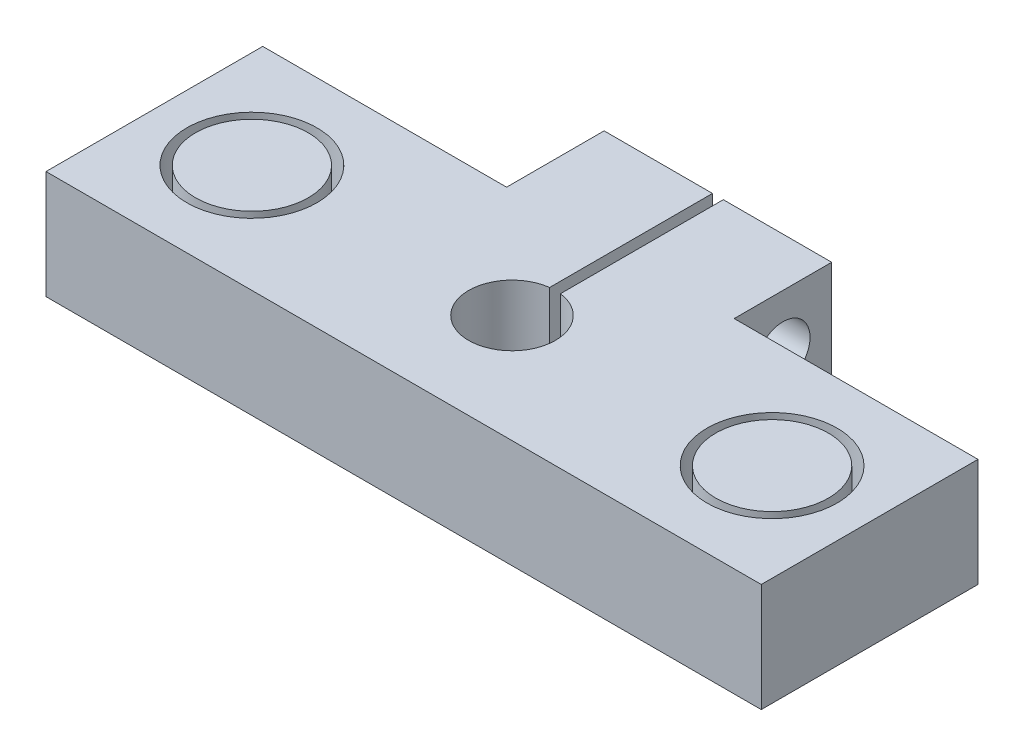
ISO-10303-21;
HEADER;
FILE_DESCRIPTION(('STEP AP214'),'2;1');
FILE_NAME('part.step','',(''),(''),'','','');
FILE_SCHEMA(('AUTOMOTIVE_DESIGN { 1 0 10303 214 1 1 1 1 }'));
ENDSEC;
DATA;
#1=APPLICATION_CONTEXT('core data for automotive mechanical design processes');
#2=APPLICATION_PROTOCOL_DEFINITION('international standard','automotive_design',2000,#1);
#3=PRODUCT_CONTEXT('',#1,'mechanical');
#4=PRODUCT('Part','Part','',(#3));
#5=PRODUCT_RELATED_PRODUCT_CATEGORY('part','',(#4));
#6=PRODUCT_DEFINITION_FORMATION('','',#4);
#7=PRODUCT_DEFINITION_CONTEXT('part definition',#1,'design');
#8=PRODUCT_DEFINITION('design','',#6,#7);
#9=PRODUCT_DEFINITION_SHAPE('','',#8);
#10=(LENGTH_UNIT() NAMED_UNIT(*) SI_UNIT(.MILLI.,.METRE.));
#11=(NAMED_UNIT(*) PLANE_ANGLE_UNIT() SI_UNIT($,.RADIAN.));
#12=(NAMED_UNIT(*) SI_UNIT($,.STERADIAN.) SOLID_ANGLE_UNIT());
#13=UNCERTAINTY_MEASURE_WITH_UNIT(LENGTH_MEASURE(1.E-05),#10,'distance_accuracy_value','');
#14=(GEOMETRIC_REPRESENTATION_CONTEXT(3) GLOBAL_UNCERTAINTY_ASSIGNED_CONTEXT((#13)) GLOBAL_UNIT_ASSIGNED_CONTEXT((#10,
#11,#12)) REPRESENTATION_CONTEXT('',''));
#15=CARTESIAN_POINT('',(0.,0.,0.));
#16=DIRECTION('',(0.,0.,1.));
#17=DIRECTION('',(1.,0.,0.));
#18=AXIS2_PLACEMENT_3D('',#15,#16,#17);
#19=CARTESIAN_POINT('',(0.,10.,0.));
#20=DIRECTION('',(0.,-1.,0.));
#21=DIRECTION('',(0.,0.,-1.));
#22=AXIS2_PLACEMENT_3D('',#19,#20,#21);
#23=CYLINDRICAL_SURFACE('',#22,4.);
#24=CARTESIAN_POINT('',(0.,0.,0.));
#25=DIRECTION('',(0.,1.,0.));
#26=DIRECTION('',(0.,0.,1.));
#27=AXIS2_PLACEMENT_3D('',#24,#25,#26);
#28=CIRCLE('',#27,4.);
#29=CARTESIAN_POINT('',(-0.5,0.,-3.96862696659689));
#30=VERTEX_POINT('',#29);
#31=CARTESIAN_POINT('',(0.5,0.,-3.96862696659689));
#32=VERTEX_POINT('',#31);
#33=EDGE_CURVE('E158',#30,#32,#28,.T.);
#34=ORIENTED_EDGE('',*,*,#33,.F.);
#35=DIRECTION('',(0.,-1.,0.));
#36=VECTOR('',#35,1.);
#37=CARTESIAN_POINT('',(-0.5,10.,-3.96862696659689));
#38=LINE('',#37,#36);
#39=CARTESIAN_POINT('',(-0.5,10.,-3.96862696659689));
#40=VERTEX_POINT('',#39);
#41=EDGE_CURVE('E11',#40,#30,#38,.T.);
#42=ORIENTED_EDGE('',*,*,#41,.F.);
#43=CARTESIAN_POINT('',(0.,10.,0.));
#44=DIRECTION('',(0.,1.,0.));
#45=DIRECTION('',(0.,0.,1.));
#46=AXIS2_PLACEMENT_3D('',#43,#44,#45);
#47=CIRCLE('',#46,4.);
#48=CARTESIAN_POINT('',(0.5,10.,-3.96862696659689));
#49=VERTEX_POINT('',#48);
#50=EDGE_CURVE('E188',#40,#49,#47,.T.);
#51=ORIENTED_EDGE('',*,*,#50,.T.);
#52=DIRECTION('',(0.,-1.,0.));
#53=VECTOR('',#52,1.);
#54=CARTESIAN_POINT('',(0.5,10.,-3.96862696659689));
#55=LINE('',#54,#53);
#56=EDGE_CURVE('E59',#49,#32,#55,.T.);
#57=ORIENTED_EDGE('',*,*,#56,.T.);
#58=EDGE_LOOP('',(#34,#42,#51,#57));
#59=FACE_BOUND('',#58,.T.);
#60=ADVANCED_FACE('F41',(#59),#23,.F.);
#61=CARTESIAN_POINT('',(-0.5,10.,0.));
#62=DIRECTION('',(1.,0.,0.));
#63=DIRECTION('',(0.,0.,-1.));
#64=AXIS2_PLACEMENT_3D('',#61,#62,#63);
#65=PLANE('',#64);
#66=CARTESIAN_POINT('',(-0.5,5.,-14.5));
#67=DIRECTION('',(1.,0.,0.));
#68=DIRECTION('',(0.,0.,-1.));
#69=AXIS2_PLACEMENT_3D('',#66,#67,#68);
#70=CIRCLE('',#69,2.50000000000001);
#71=CARTESIAN_POINT('',(-0.5,5.,-17.));
#72=VERTEX_POINT('',#71);
#73=EDGE_CURVE('E161',#72,#72,#70,.T.);
#74=ORIENTED_EDGE('',*,*,#73,.F.);
#75=EDGE_LOOP('',(#74));
#76=FACE_BOUND('',#75,.T.);
#77=DIRECTION('',(0.,0.,1.));
#78=VECTOR('',#77,1.);
#79=CARTESIAN_POINT('',(-0.5,0.,0.));
#80=LINE('',#79,#78);
#81=CARTESIAN_POINT('',(-0.5,0.,-19.));
#82=VERTEX_POINT('',#81);
#83=EDGE_CURVE('E159',#82,#30,#80,.T.);
#84=ORIENTED_EDGE('',*,*,#83,.F.);
#85=DIRECTION('',(0.,-1.,0.));
#86=VECTOR('',#85,1.);
#87=CARTESIAN_POINT('',(-0.5,10.,-19.));
#88=LINE('',#87,#86);
#89=CARTESIAN_POINT('',(-0.5,10.,-19.));
#90=VERTEX_POINT('',#89);
#91=EDGE_CURVE('E49',#90,#82,#88,.T.);
#92=ORIENTED_EDGE('',*,*,#91,.F.);
#93=DIRECTION('',(0.,0.,1.));
#94=VECTOR('',#93,1.);
#95=CARTESIAN_POINT('',(-0.5,10.,0.));
#96=LINE('',#95,#94);
#97=EDGE_CURVE('E222',#90,#40,#96,.T.);
#98=ORIENTED_EDGE('',*,*,#97,.T.);
#99=ORIENTED_EDGE('',*,*,#41,.T.);
#100=EDGE_LOOP('',(#84,#92,#98,#99));
#101=FACE_BOUND('',#100,.T.);
#102=ADVANCED_FACE('F219',(#76,#101),#65,.T.);
#103=CARTESIAN_POINT('',(0.,10.,-19.));
#104=DIRECTION('',(0.,0.,1.));
#105=DIRECTION('',(1.,0.,0.));
#106=AXIS2_PLACEMENT_3D('',#103,#104,#105);
#107=PLANE('',#106);
#108=DIRECTION('',(-1.,0.,0.));
#109=VECTOR('',#108,1.);
#110=CARTESIAN_POINT('',(0.,0.,-19.));
#111=LINE('',#110,#109);
#112=CARTESIAN_POINT('',(-10.5,0.,-19.));
#113=VERTEX_POINT('',#112);
#114=EDGE_CURVE('E163',#82,#113,#111,.T.);
#115=ORIENTED_EDGE('',*,*,#114,.T.);
#116=DIRECTION('',(0.,-1.,0.));
#117=VECTOR('',#116,1.);
#118=CARTESIAN_POINT('',(-10.5,10.,-19.));
#119=LINE('',#118,#117);
#120=CARTESIAN_POINT('',(-10.5,10.,-19.));
#121=VERTEX_POINT('',#120);
#122=EDGE_CURVE('E204',#121,#113,#119,.T.);
#123=ORIENTED_EDGE('',*,*,#122,.F.);
#124=DIRECTION('',(-1.,0.,0.));
#125=VECTOR('',#124,1.);
#126=CARTESIAN_POINT('',(0.,10.,-19.));
#127=LINE('',#126,#125);
#128=EDGE_CURVE('E215',#90,#121,#127,.T.);
#129=ORIENTED_EDGE('',*,*,#128,.F.);
#130=ORIENTED_EDGE('',*,*,#91,.T.);
#131=EDGE_LOOP('',(#115,#123,#129,#130));
#132=FACE_BOUND('',#131,.T.);
#133=ADVANCED_FACE('F209',(#132),#107,.F.);
#134=CARTESIAN_POINT('',(-10.5,10.,0.));
#135=DIRECTION('',(1.,0.,0.));
#136=DIRECTION('',(0.,0.,-1.));
#137=AXIS2_PLACEMENT_3D('',#134,#135,#136);
#138=PLANE('',#137);
#139=CARTESIAN_POINT('',(-10.5,5.,-14.5));
#140=DIRECTION('',(1.,0.,0.));
#141=DIRECTION('',(0.,0.,-1.));
#142=AXIS2_PLACEMENT_3D('',#139,#140,#141);
#143=CIRCLE('',#142,2.50000000000001);
#144=CARTESIAN_POINT('',(-10.5,5.,-17.));
#145=VERTEX_POINT('',#144);
#146=EDGE_CURVE('E278',#145,#145,#143,.T.);
#147=ORIENTED_EDGE('',*,*,#146,.T.);
#148=EDGE_LOOP('',(#147));
#149=FACE_BOUND('',#148,.T.);
#150=DIRECTION('',(0.,0.,1.));
#151=VECTOR('',#150,1.);
#152=CARTESIAN_POINT('',(-10.5,0.,0.));
#153=LINE('',#152,#151);
#154=CARTESIAN_POINT('',(-10.5,0.,-10.));
#155=VERTEX_POINT('',#154);
#156=EDGE_CURVE('E167',#113,#155,#153,.T.);
#157=ORIENTED_EDGE('',*,*,#156,.T.);
#158=DIRECTION('',(0.,-1.,0.));
#159=VECTOR('',#158,1.);
#160=CARTESIAN_POINT('',(-10.5,10.,-10.));
#161=LINE('',#160,#159);
#162=CARTESIAN_POINT('',(-10.5,10.,-10.));
#163=VERTEX_POINT('',#162);
#164=EDGE_CURVE('E205',#163,#155,#161,.T.);
#165=ORIENTED_EDGE('',*,*,#164,.F.);
#166=DIRECTION('',(0.,0.,1.));
#167=VECTOR('',#166,1.);
#168=CARTESIAN_POINT('',(-10.5,10.,0.));
#169=LINE('',#168,#167);
#170=EDGE_CURVE('E293',#121,#163,#169,.T.);
#171=ORIENTED_EDGE('',*,*,#170,.F.);
#172=ORIENTED_EDGE('',*,*,#122,.T.);
#173=EDGE_LOOP('',(#157,#165,#171,#172));
#174=FACE_BOUND('',#173,.T.);
#175=ADVANCED_FACE('F249',(#149,#174),#138,.F.);
#176=CARTESIAN_POINT('',(0.,10.,-10.));
#177=DIRECTION('',(0.,0.,-1.));
#178=DIRECTION('',(-1.,0.,0.));
#179=AXIS2_PLACEMENT_3D('',#176,#177,#178);
#180=PLANE('',#179);
#181=DIRECTION('',(1.,0.,0.));
#182=VECTOR('',#181,1.);
#183=CARTESIAN_POINT('',(0.,0.,-10.));
#184=LINE('',#183,#182);
#185=CARTESIAN_POINT('',(-33.,0.,-10.));
#186=VERTEX_POINT('',#185);
#187=EDGE_CURVE('E166',#186,#155,#184,.T.);
#188=ORIENTED_EDGE('',*,*,#187,.F.);
#189=DIRECTION('',(0.,-1.,0.));
#190=VECTOR('',#189,1.);
#191=CARTESIAN_POINT('',(-33.,10.,-10.));
#192=LINE('',#191,#190);
#193=CARTESIAN_POINT('',(-33.,10.,-10.));
#194=VERTEX_POINT('',#193);
#195=EDGE_CURVE('E199',#194,#186,#192,.T.);
#196=ORIENTED_EDGE('',*,*,#195,.F.);
#197=DIRECTION('',(1.,0.,0.));
#198=VECTOR('',#197,1.);
#199=CARTESIAN_POINT('',(0.,10.,-10.));
#200=LINE('',#199,#198);
#201=EDGE_CURVE('E300',#194,#163,#200,.T.);
#202=ORIENTED_EDGE('',*,*,#201,.T.);
#203=ORIENTED_EDGE('',*,*,#164,.T.);
#204=EDGE_LOOP('',(#188,#196,#202,#203));
#205=FACE_BOUND('',#204,.T.);
#206=ADVANCED_FACE('F252',(#205),#180,.T.);
#207=CARTESIAN_POINT('',(-33.,10.,0.));
#208=DIRECTION('',(-1.,0.,0.));
#209=DIRECTION('',(0.,0.,1.));
#210=AXIS2_PLACEMENT_3D('',#207,#208,#209);
#211=PLANE('',#210);
#212=DIRECTION('',(0.,0.,-1.));
#213=VECTOR('',#212,1.);
#214=CARTESIAN_POINT('',(-33.,0.,0.));
#215=LINE('',#214,#213);
#216=CARTESIAN_POINT('',(-33.,0.,10.));
#217=VERTEX_POINT('',#216);
#218=EDGE_CURVE('E175',#217,#186,#215,.T.);
#219=ORIENTED_EDGE('',*,*,#218,.F.);
#220=DIRECTION('',(0.,-1.,0.));
#221=VECTOR('',#220,1.);
#222=CARTESIAN_POINT('',(-33.,10.,10.));
#223=LINE('',#222,#221);
#224=CARTESIAN_POINT('',(-33.,10.,10.));
#225=VERTEX_POINT('',#224);
#226=EDGE_CURVE('E196',#225,#217,#223,.T.);
#227=ORIENTED_EDGE('',*,*,#226,.F.);
#228=DIRECTION('',(0.,0.,-1.));
#229=VECTOR('',#228,1.);
#230=CARTESIAN_POINT('',(-33.,10.,0.));
#231=LINE('',#230,#229);
#232=EDGE_CURVE('E298',#225,#194,#231,.T.);
#233=ORIENTED_EDGE('',*,*,#232,.T.);
#234=ORIENTED_EDGE('',*,*,#195,.T.);
#235=EDGE_LOOP('',(#219,#227,#233,#234));
#236=FACE_BOUND('',#235,.T.);
#237=ADVANCED_FACE('F258',(#236),#211,.T.);
#238=CARTESIAN_POINT('',(0.,10.,10.));
#239=DIRECTION('',(0.,0.,1.));
#240=DIRECTION('',(1.,0.,0.));
#241=AXIS2_PLACEMENT_3D('',#238,#239,#240);
#242=PLANE('',#241);
#243=DIRECTION('',(-1.,0.,0.));
#244=VECTOR('',#243,1.);
#245=CARTESIAN_POINT('',(0.,0.,10.));
#246=LINE('',#245,#244);
#247=CARTESIAN_POINT('',(33.,0.,10.));
#248=VERTEX_POINT('',#247);
#249=EDGE_CURVE('E173',#248,#217,#246,.T.);
#250=ORIENTED_EDGE('',*,*,#249,.F.);
#251=DIRECTION('',(0.,-1.,0.));
#252=VECTOR('',#251,1.);
#253=CARTESIAN_POINT('',(33.,10.,10.));
#254=LINE('',#253,#252);
#255=CARTESIAN_POINT('',(33.,10.,10.));
#256=VERTEX_POINT('',#255);
#257=EDGE_CURVE('E198',#256,#248,#254,.T.);
#258=ORIENTED_EDGE('',*,*,#257,.F.);
#259=DIRECTION('',(-1.,0.,0.));
#260=VECTOR('',#259,1.);
#261=CARTESIAN_POINT('',(0.,10.,10.));
#262=LINE('',#261,#260);
#263=EDGE_CURVE('E305',#256,#225,#262,.T.);
#264=ORIENTED_EDGE('',*,*,#263,.T.);
#265=ORIENTED_EDGE('',*,*,#226,.T.);
#266=EDGE_LOOP('',(#250,#258,#264,#265));
#267=FACE_BOUND('',#266,.T.);
#268=ADVANCED_FACE('F257',(#267),#242,.T.);
#269=CARTESIAN_POINT('',(33.,10.,0.));
#270=DIRECTION('',(-1.,0.,0.));
#271=DIRECTION('',(0.,0.,1.));
#272=AXIS2_PLACEMENT_3D('',#269,#270,#271);
#273=PLANE('',#272);
#274=DIRECTION('',(0.,0.,-1.));
#275=VECTOR('',#274,1.);
#276=CARTESIAN_POINT('',(33.,0.,0.));
#277=LINE('',#276,#275);
#278=CARTESIAN_POINT('',(33.,0.,-10.));
#279=VERTEX_POINT('',#278);
#280=EDGE_CURVE('E180',#248,#279,#277,.T.);
#281=ORIENTED_EDGE('',*,*,#280,.T.);
#282=DIRECTION('',(0.,-1.,0.));
#283=VECTOR('',#282,1.);
#284=CARTESIAN_POINT('',(33.,10.,-10.));
#285=LINE('',#284,#283);
#286=CARTESIAN_POINT('',(33.,10.,-10.));
#287=VERTEX_POINT('',#286);
#288=EDGE_CURVE('E191',#287,#279,#285,.T.);
#289=ORIENTED_EDGE('',*,*,#288,.F.);
#290=DIRECTION('',(0.,0.,-1.));
#291=VECTOR('',#290,1.);
#292=CARTESIAN_POINT('',(33.,10.,0.));
#293=LINE('',#292,#291);
#294=EDGE_CURVE('E308',#256,#287,#293,.T.);
#295=ORIENTED_EDGE('',*,*,#294,.F.);
#296=ORIENTED_EDGE('',*,*,#257,.T.);
#297=EDGE_LOOP('',(#281,#289,#295,#296));
#298=FACE_BOUND('',#297,.T.);
#299=ADVANCED_FACE('F262',(#298),#273,.F.);
#300=CARTESIAN_POINT('',(0.,10.,-10.));
#301=DIRECTION('',(0.,0.,-1.));
#302=DIRECTION('',(-1.,0.,0.));
#303=AXIS2_PLACEMENT_3D('',#300,#301,#302);
#304=PLANE('',#303);
#305=DIRECTION('',(1.,0.,0.));
#306=VECTOR('',#305,1.);
#307=CARTESIAN_POINT('',(0.,0.,-10.));
#308=LINE('',#307,#306);
#309=CARTESIAN_POINT('',(10.5,0.,-10.));
#310=VERTEX_POINT('',#309);
#311=EDGE_CURVE('E182',#310,#279,#308,.T.);
#312=ORIENTED_EDGE('',*,*,#311,.F.);
#313=DIRECTION('',(0.,-1.,0.));
#314=VECTOR('',#313,1.);
#315=CARTESIAN_POINT('',(10.5,10.,-10.));
#316=LINE('',#315,#314);
#317=CARTESIAN_POINT('',(10.5,10.,-10.));
#318=VERTEX_POINT('',#317);
#319=EDGE_CURVE('E143',#318,#310,#316,.T.);
#320=ORIENTED_EDGE('',*,*,#319,.F.);
#321=DIRECTION('',(1.,0.,0.));
#322=VECTOR('',#321,1.);
#323=CARTESIAN_POINT('',(0.,10.,-10.));
#324=LINE('',#323,#322);
#325=EDGE_CURVE('E147',#318,#287,#324,.T.);
#326=ORIENTED_EDGE('',*,*,#325,.T.);
#327=ORIENTED_EDGE('',*,*,#288,.T.);
#328=EDGE_LOOP('',(#312,#320,#326,#327));
#329=FACE_BOUND('',#328,.T.);
#330=ADVANCED_FACE('F268',(#329),#304,.T.);
#331=CARTESIAN_POINT('',(10.5,10.,0.));
#332=DIRECTION('',(1.,0.,0.));
#333=DIRECTION('',(0.,0.,-1.));
#334=AXIS2_PLACEMENT_3D('',#331,#332,#333);
#335=PLANE('',#334);
#336=CARTESIAN_POINT('',(10.5,5.,-14.5));
#337=DIRECTION('',(1.,0.,0.));
#338=DIRECTION('',(0.,0.,-1.));
#339=AXIS2_PLACEMENT_3D('',#336,#337,#338);
#340=CIRCLE('',#339,2.50000000000001);
#341=CARTESIAN_POINT('',(10.5,5.,-17.));
#342=VERTEX_POINT('',#341);
#343=EDGE_CURVE('E279',#342,#342,#340,.T.);
#344=ORIENTED_EDGE('',*,*,#343,.F.);
#345=EDGE_LOOP('',(#344));
#346=FACE_BOUND('',#345,.T.);
#347=DIRECTION('',(0.,0.,1.));
#348=VECTOR('',#347,1.);
#349=CARTESIAN_POINT('',(10.5,0.,0.));
#350=LINE('',#349,#348);
#351=CARTESIAN_POINT('',(10.5,0.,-19.));
#352=VERTEX_POINT('',#351);
#353=EDGE_CURVE('E139',#352,#310,#350,.T.);
#354=ORIENTED_EDGE('',*,*,#353,.F.);
#355=DIRECTION('',(0.,-1.,0.));
#356=VECTOR('',#355,1.);
#357=CARTESIAN_POINT('',(10.5,10.,-19.));
#358=LINE('',#357,#356);
#359=CARTESIAN_POINT('',(10.5,10.,-19.));
#360=VERTEX_POINT('',#359);
#361=EDGE_CURVE('E135',#360,#352,#358,.T.);
#362=ORIENTED_EDGE('',*,*,#361,.F.);
#363=DIRECTION('',(0.,0.,1.));
#364=VECTOR('',#363,1.);
#365=CARTESIAN_POINT('',(10.5,10.,0.));
#366=LINE('',#365,#364);
#367=EDGE_CURVE('E133',#360,#318,#366,.T.);
#368=ORIENTED_EDGE('',*,*,#367,.T.);
#369=ORIENTED_EDGE('',*,*,#319,.T.);
#370=EDGE_LOOP('',(#354,#362,#368,#369));
#371=FACE_BOUND('',#370,.T.);
#372=ADVANCED_FACE('F131',(#346,#371),#335,.T.);
#373=CARTESIAN_POINT('',(0.,10.,-19.));
#374=DIRECTION('',(0.,0.,-1.));
#375=DIRECTION('',(-1.,0.,0.));
#376=AXIS2_PLACEMENT_3D('',#373,#374,#375);
#377=PLANE('',#376);
#378=DIRECTION('',(1.,0.,0.));
#379=VECTOR('',#378,1.);
#380=CARTESIAN_POINT('',(0.,0.,-19.));
#381=LINE('',#380,#379);
#382=CARTESIAN_POINT('',(0.5,0.,-19.));
#383=VERTEX_POINT('',#382);
#384=EDGE_CURVE('E183',#383,#352,#381,.T.);
#385=ORIENTED_EDGE('',*,*,#384,.F.);
#386=DIRECTION('',(0.,-1.,0.));
#387=VECTOR('',#386,1.);
#388=CARTESIAN_POINT('',(0.5,10.,-19.));
#389=LINE('',#388,#387);
#390=CARTESIAN_POINT('',(0.5,10.,-19.));
#391=VERTEX_POINT('',#390);
#392=EDGE_CURVE('E92',#391,#383,#389,.T.);
#393=ORIENTED_EDGE('',*,*,#392,.F.);
#394=DIRECTION('',(1.,0.,0.));
#395=VECTOR('',#394,1.);
#396=CARTESIAN_POINT('',(0.,10.,-19.));
#397=LINE('',#396,#395);
#398=EDGE_CURVE('E146',#391,#360,#397,.T.);
#399=ORIENTED_EDGE('',*,*,#398,.T.);
#400=ORIENTED_EDGE('',*,*,#361,.T.);
#401=EDGE_LOOP('',(#385,#393,#399,#400));
#402=FACE_BOUND('',#401,.T.);
#403=ADVANCED_FACE('F155',(#402),#377,.T.);
#404=CARTESIAN_POINT('',(0.5,10.,0.));
#405=DIRECTION('',(-1.,0.,0.));
#406=DIRECTION('',(0.,0.,1.));
#407=AXIS2_PLACEMENT_3D('',#404,#405,#406);
#408=PLANE('',#407);
#409=CARTESIAN_POINT('',(0.5,5.,-14.5));
#410=DIRECTION('',(-1.,0.,0.));
#411=DIRECTION('',(0.,0.,1.));
#412=AXIS2_PLACEMENT_3D('',#409,#410,#411);
#413=CIRCLE('',#412,2.50000000000001);
#414=CARTESIAN_POINT('',(0.5,5.,-17.));
#415=VERTEX_POINT('',#414);
#416=EDGE_CURVE('E42',#415,#415,#413,.T.);
#417=ORIENTED_EDGE('',*,*,#416,.F.);
#418=EDGE_LOOP('',(#417));
#419=FACE_BOUND('',#418,.T.);
#420=DIRECTION('',(0.,0.,-1.));
#421=VECTOR('',#420,1.);
#422=CARTESIAN_POINT('',(0.5,0.,0.));
#423=LINE('',#422,#421);
#424=EDGE_CURVE('E190',#32,#383,#423,.T.);
#425=ORIENTED_EDGE('',*,*,#424,.F.);
#426=ORIENTED_EDGE('',*,*,#56,.F.);
#427=DIRECTION('',(0.,0.,-1.));
#428=VECTOR('',#427,1.);
#429=CARTESIAN_POINT('',(0.5,10.,0.));
#430=LINE('',#429,#428);
#431=EDGE_CURVE('E153',#49,#391,#430,.T.);
#432=ORIENTED_EDGE('',*,*,#431,.T.);
#433=ORIENTED_EDGE('',*,*,#392,.T.);
#434=EDGE_LOOP('',(#425,#426,#432,#433));
#435=FACE_BOUND('',#434,.T.);
#436=ADVANCED_FACE('F225',(#419,#435),#408,.T.);
#437=CARTESIAN_POINT('',(0.,10.,0.));
#438=DIRECTION('',(0.,1.,0.));
#439=DIRECTION('',(0.,0.,1.));
#440=AXIS2_PLACEMENT_3D('',#437,#438,#439);
#441=PLANE('',#440);
#442=CARTESIAN_POINT('',(24.,10.,0.));
#443=DIRECTION('',(0.,1.,0.));
#444=DIRECTION('',(0.,0.,1.));
#445=AXIS2_PLACEMENT_3D('',#442,#443,#444);
#446=CIRCLE('',#445,6.);
#447=CARTESIAN_POINT('',(24.,10.,6.));
#448=VERTEX_POINT('',#447);
#449=EDGE_CURVE('E287',#448,#448,#446,.T.);
#450=ORIENTED_EDGE('',*,*,#449,.F.);
#451=EDGE_LOOP('',(#450));
#452=FACE_BOUND('',#451,.T.);
#453=CARTESIAN_POINT('',(-24.,10.,0.));
#454=DIRECTION('',(0.,1.,0.));
#455=DIRECTION('',(0.,0.,1.));
#456=AXIS2_PLACEMENT_3D('',#453,#454,#455);
#457=CIRCLE('',#456,6.);
#458=CARTESIAN_POINT('',(-24.,10.,6.));
#459=VERTEX_POINT('',#458);
#460=EDGE_CURVE('E367',#459,#459,#457,.T.);
#461=ORIENTED_EDGE('',*,*,#460,.F.);
#462=EDGE_LOOP('',(#461));
#463=FACE_BOUND('',#462,.T.);
#464=ORIENTED_EDGE('',*,*,#50,.F.);
#465=ORIENTED_EDGE('',*,*,#97,.F.);
#466=ORIENTED_EDGE('',*,*,#128,.T.);
#467=ORIENTED_EDGE('',*,*,#170,.T.);
#468=ORIENTED_EDGE('',*,*,#201,.F.);
#469=ORIENTED_EDGE('',*,*,#232,.F.);
#470=ORIENTED_EDGE('',*,*,#263,.F.);
#471=ORIENTED_EDGE('',*,*,#294,.T.);
#472=ORIENTED_EDGE('',*,*,#325,.F.);
#473=ORIENTED_EDGE('',*,*,#367,.F.);
#474=ORIENTED_EDGE('',*,*,#398,.F.);
#475=ORIENTED_EDGE('',*,*,#431,.F.);
#476=EDGE_LOOP('',(#464,#465,#466,#467,#468,#469,#470,#471,#472,#473,#474,#475));
#477=FACE_BOUND('',#476,.T.);
#478=ADVANCED_FACE('F148',(#452,#463,#477),#441,.T.);
#479=CARTESIAN_POINT('',(0.,0.,0.));
#480=DIRECTION('',(0.,1.,0.));
#481=DIRECTION('',(0.,0.,1.));
#482=AXIS2_PLACEMENT_3D('',#479,#480,#481);
#483=PLANE('',#482);
#484=ORIENTED_EDGE('',*,*,#33,.T.);
#485=ORIENTED_EDGE('',*,*,#424,.T.);
#486=ORIENTED_EDGE('',*,*,#384,.T.);
#487=ORIENTED_EDGE('',*,*,#353,.T.);
#488=ORIENTED_EDGE('',*,*,#311,.T.);
#489=ORIENTED_EDGE('',*,*,#280,.F.);
#490=ORIENTED_EDGE('',*,*,#249,.T.);
#491=ORIENTED_EDGE('',*,*,#218,.T.);
#492=ORIENTED_EDGE('',*,*,#187,.T.);
#493=ORIENTED_EDGE('',*,*,#156,.F.);
#494=ORIENTED_EDGE('',*,*,#114,.F.);
#495=ORIENTED_EDGE('',*,*,#83,.T.);
#496=EDGE_LOOP('',(#484,#485,#486,#487,#488,#489,#490,#491,#492,#493,#494,#495));
#497=FACE_BOUND('',#496,.T.);
#498=ADVANCED_FACE('F218',(#497),#483,.F.);
#499=CARTESIAN_POINT('',(-10.5,5.,-14.5));
#500=DIRECTION('',(1.,0.,0.));
#501=DIRECTION('',(0.,0.,-1.));
#502=AXIS2_PLACEMENT_3D('',#499,#500,#501);
#503=CYLINDRICAL_SURFACE('',#502,2.50000000000001);
#504=CARTESIAN_POINT('',(0.5,5.,-17.));
#505=CARTESIAN_POINT('',(0.604166666666667,5.,-17.));
#506=CARTESIAN_POINT('',(0.708333333333334,5.,-17.));
#507=CARTESIAN_POINT('',(0.916666666666668,5.,-17.));
#508=CARTESIAN_POINT('',(1.02083333333333,5.,-17.));
#509=CARTESIAN_POINT('',(1.22916666666667,5.,-17.));
#510=CARTESIAN_POINT('',(1.33333333333333,5.,-17.));
#511=CARTESIAN_POINT('',(1.54166666666667,5.,-17.));
#512=CARTESIAN_POINT('',(1.64583333333333,5.,-17.));
#513=CARTESIAN_POINT('',(1.85416666666667,5.,-17.));
#514=CARTESIAN_POINT('',(1.95833333333333,5.,-17.));
#515=CARTESIAN_POINT('',(2.16666666666667,5.,-17.));
#516=CARTESIAN_POINT('',(2.27083333333333,5.,-17.));
#517=CARTESIAN_POINT('',(2.47916666666667,5.,-17.));
#518=CARTESIAN_POINT('',(2.58333333333333,5.,-17.));
#519=CARTESIAN_POINT('',(2.79166666666667,5.,-17.));
#520=CARTESIAN_POINT('',(2.89583333333333,5.,-17.));
#521=CARTESIAN_POINT('',(3.10416666666667,5.,-17.));
#522=CARTESIAN_POINT('',(3.20833333333333,5.,-17.));
#523=CARTESIAN_POINT('',(3.41666666666667,5.,-17.));
#524=CARTESIAN_POINT('',(3.52083333333333,5.,-17.));
#525=CARTESIAN_POINT('',(3.72916666666667,5.,-17.));
#526=CARTESIAN_POINT('',(3.83333333333333,5.,-17.));
#527=CARTESIAN_POINT('',(4.04166666666667,5.,-17.));
#528=CARTESIAN_POINT('',(4.14583333333333,5.,-17.));
#529=CARTESIAN_POINT('',(4.35416666666667,5.,-17.));
#530=CARTESIAN_POINT('',(4.45833333333333,5.,-17.));
#531=CARTESIAN_POINT('',(4.66666666666667,5.,-17.));
#532=CARTESIAN_POINT('',(4.77083333333333,5.,-17.));
#533=CARTESIAN_POINT('',(4.97916666666667,5.,-17.));
#534=CARTESIAN_POINT('',(5.08333333333333,5.,-17.));
#535=CARTESIAN_POINT('',(5.29166666666667,5.,-17.));
#536=CARTESIAN_POINT('',(5.39583333333333,5.,-17.));
#537=CARTESIAN_POINT('',(5.60416666666667,5.,-17.));
#538=CARTESIAN_POINT('',(5.70833333333333,5.,-17.));
#539=CARTESIAN_POINT('',(5.91666666666667,5.,-17.));
#540=CARTESIAN_POINT('',(6.02083333333333,5.,-17.));
#541=CARTESIAN_POINT('',(6.22916666666667,5.,-17.));
#542=CARTESIAN_POINT('',(6.33333333333333,5.,-17.));
#543=CARTESIAN_POINT('',(6.54166666666667,5.,-17.));
#544=CARTESIAN_POINT('',(6.64583333333333,5.,-17.));
#545=CARTESIAN_POINT('',(6.85416666666667,5.,-17.));
#546=CARTESIAN_POINT('',(6.95833333333333,5.,-17.));
#547=CARTESIAN_POINT('',(7.16666666666667,5.,-17.));
#548=CARTESIAN_POINT('',(7.27083333333333,5.,-17.));
#549=CARTESIAN_POINT('',(7.47916666666666,5.,-17.));
#550=CARTESIAN_POINT('',(7.58333333333333,5.,-17.));
#551=CARTESIAN_POINT('',(7.79166666666666,5.,-17.));
#552=CARTESIAN_POINT('',(7.89583333333333,5.,-17.));
#553=CARTESIAN_POINT('',(8.10416666666667,5.,-17.));
#554=CARTESIAN_POINT('',(8.20833333333333,5.,-17.));
#555=CARTESIAN_POINT('',(8.41666666666667,5.,-17.));
#556=CARTESIAN_POINT('',(8.52083333333333,5.,-17.));
#557=CARTESIAN_POINT('',(8.72916666666667,5.,-17.));
#558=CARTESIAN_POINT('',(8.83333333333333,5.,-17.));
#559=CARTESIAN_POINT('',(9.04166666666667,5.,-17.));
#560=CARTESIAN_POINT('',(9.14583333333333,5.,-17.));
#561=CARTESIAN_POINT('',(9.35416666666667,5.,-17.));
#562=CARTESIAN_POINT('',(9.45833333333333,5.,-17.));
#563=CARTESIAN_POINT('',(9.66666666666667,5.,-17.));
#564=CARTESIAN_POINT('',(9.77083333333333,5.,-17.));
#565=CARTESIAN_POINT('',(9.97916666666667,5.,-17.));
#566=CARTESIAN_POINT('',(10.0833333333333,5.,-17.));
#567=CARTESIAN_POINT('',(10.2916666666667,5.,-17.));
#568=CARTESIAN_POINT('',(10.3958333333333,5.,-17.));
#569=CARTESIAN_POINT('',(10.5,5.,-17.));
#570=B_SPLINE_CURVE_WITH_KNOTS('',3,(#504,#505,#506,#507,#508,#509,#510,#511,#512,#513,#514,
#515,#516,#517,#518,#519,#520,#521,#522,#523,#524,#525,#526,#527,#528,#529,#530,#531,#532,#533,
#534,#535,#536,#537,#538,#539,#540,#541,#542,#543,#544,#545,#546,#547,#548,#549,#550,#551,#552,
#553,#554,#555,#556,#557,#558,#559,#560,#561,#562,#563,#564,#565,#566,#567,#568,#569),
.UNSPECIFIED.,.F.,.F.,(4,2,2,2,2,2,2,2,2,2,2,2,2,2,2,2,2,2,2,2,2,2,2,2,2,2,2,2,2,2,2,2,4),(0.,
0.3125,0.625000000000001,0.937500000000001,1.25,1.5625,1.875,2.1875,2.5,2.8125,3.125,3.4375,
3.75,4.0625,4.375,4.6875,5.,5.3125,5.625,5.9375,6.25,6.5625,6.875,7.1875,7.5,7.8125,8.125,
8.4375,8.75,9.0625,9.375,9.6875,10.),.UNSPECIFIED.);
#571=EDGE_CURVE('BSEAM323',#415,#342,#570,.T.);
#572=ORIENTED_EDGE('',*,*,#416,.T.);
#573=ORIENTED_EDGE('',*,*,#343,.T.);
#574=ORIENTED_EDGE('',*,*,#571,.T.);
#575=ORIENTED_EDGE('',*,*,#571,.F.);
#576=EDGE_LOOP('',(#572,#574,#573,#575));
#577=FACE_BOUND('',#576,.T.);
#578=ADVANCED_FACE('F323',(#577),#503,.F.);
#579=CARTESIAN_POINT('',(-0.5,5.,-17.));
#580=CARTESIAN_POINT('',(-0.604166666666667,5.,-17.));
#581=CARTESIAN_POINT('',(-0.708333333333334,5.,-17.));
#582=CARTESIAN_POINT('',(-0.916666666666668,5.,-17.));
#583=CARTESIAN_POINT('',(-1.02083333333333,5.,-17.));
#584=CARTESIAN_POINT('',(-1.22916666666667,5.,-17.));
#585=CARTESIAN_POINT('',(-1.33333333333333,5.,-17.));
#586=CARTESIAN_POINT('',(-1.54166666666667,5.,-17.));
#587=CARTESIAN_POINT('',(-1.64583333333333,5.,-17.));
#588=CARTESIAN_POINT('',(-1.85416666666667,5.,-17.));
#589=CARTESIAN_POINT('',(-1.95833333333333,5.,-17.));
#590=CARTESIAN_POINT('',(-2.16666666666667,5.,-17.));
#591=CARTESIAN_POINT('',(-2.27083333333333,5.,-17.));
#592=CARTESIAN_POINT('',(-2.47916666666667,5.,-17.));
#593=CARTESIAN_POINT('',(-2.58333333333333,5.,-17.));
#594=CARTESIAN_POINT('',(-2.79166666666667,5.,-17.));
#595=CARTESIAN_POINT('',(-2.89583333333333,5.,-17.));
#596=CARTESIAN_POINT('',(-3.10416666666667,5.,-17.));
#597=CARTESIAN_POINT('',(-3.20833333333333,5.,-17.));
#598=CARTESIAN_POINT('',(-3.41666666666667,5.,-17.));
#599=CARTESIAN_POINT('',(-3.52083333333333,5.,-17.));
#600=CARTESIAN_POINT('',(-3.72916666666667,5.,-17.));
#601=CARTESIAN_POINT('',(-3.83333333333333,5.,-17.));
#602=CARTESIAN_POINT('',(-4.04166666666667,5.,-17.));
#603=CARTESIAN_POINT('',(-4.14583333333333,5.,-17.));
#604=CARTESIAN_POINT('',(-4.35416666666667,5.,-17.));
#605=CARTESIAN_POINT('',(-4.45833333333333,5.,-17.));
#606=CARTESIAN_POINT('',(-4.66666666666667,5.,-17.));
#607=CARTESIAN_POINT('',(-4.77083333333333,5.,-17.));
#608=CARTESIAN_POINT('',(-4.97916666666667,5.,-17.));
#609=CARTESIAN_POINT('',(-5.08333333333333,5.,-17.));
#610=CARTESIAN_POINT('',(-5.29166666666667,5.,-17.));
#611=CARTESIAN_POINT('',(-5.39583333333333,5.,-17.));
#612=CARTESIAN_POINT('',(-5.60416666666667,5.,-17.));
#613=CARTESIAN_POINT('',(-5.70833333333333,5.,-17.));
#614=CARTESIAN_POINT('',(-5.91666666666667,5.,-17.));
#615=CARTESIAN_POINT('',(-6.02083333333333,5.,-17.));
#616=CARTESIAN_POINT('',(-6.22916666666667,5.,-17.));
#617=CARTESIAN_POINT('',(-6.33333333333333,5.,-17.));
#618=CARTESIAN_POINT('',(-6.54166666666667,5.,-17.));
#619=CARTESIAN_POINT('',(-6.64583333333333,5.,-17.));
#620=CARTESIAN_POINT('',(-6.85416666666667,5.,-17.));
#621=CARTESIAN_POINT('',(-6.95833333333333,5.,-17.));
#622=CARTESIAN_POINT('',(-7.16666666666667,5.,-17.));
#623=CARTESIAN_POINT('',(-7.27083333333333,5.,-17.));
#624=CARTESIAN_POINT('',(-7.47916666666667,5.,-17.));
#625=CARTESIAN_POINT('',(-7.58333333333333,5.,-17.));
#626=CARTESIAN_POINT('',(-7.79166666666667,5.,-17.));
#627=CARTESIAN_POINT('',(-7.89583333333333,5.,-17.));
#628=CARTESIAN_POINT('',(-8.10416666666667,5.,-17.));
#629=CARTESIAN_POINT('',(-8.20833333333333,5.,-17.));
#630=CARTESIAN_POINT('',(-8.41666666666667,5.,-17.));
#631=CARTESIAN_POINT('',(-8.52083333333333,5.,-17.));
#632=CARTESIAN_POINT('',(-8.72916666666667,5.,-17.));
#633=CARTESIAN_POINT('',(-8.83333333333333,5.,-17.));
#634=CARTESIAN_POINT('',(-9.04166666666667,5.,-17.));
#635=CARTESIAN_POINT('',(-9.14583333333333,5.,-17.));
#636=CARTESIAN_POINT('',(-9.35416666666667,5.,-17.));
#637=CARTESIAN_POINT('',(-9.45833333333333,5.,-17.));
#638=CARTESIAN_POINT('',(-9.66666666666667,5.,-17.));
#639=CARTESIAN_POINT('',(-9.77083333333333,5.,-17.));
#640=CARTESIAN_POINT('',(-9.97916666666667,5.,-17.));
#641=CARTESIAN_POINT('',(-10.0833333333333,5.,-17.));
#642=CARTESIAN_POINT('',(-10.2916666666667,5.,-17.));
#643=CARTESIAN_POINT('',(-10.3958333333333,5.,-17.));
#644=CARTESIAN_POINT('',(-10.5,5.,-17.));
#645=B_SPLINE_CURVE_WITH_KNOTS('',3,(#579,#580,#581,#582,#583,#584,#585,#586,#587,#588,#589,
#590,#591,#592,#593,#594,#595,#596,#597,#598,#599,#600,#601,#602,#603,#604,#605,#606,#607,#608,
#609,#610,#611,#612,#613,#614,#615,#616,#617,#618,#619,#620,#621,#622,#623,#624,#625,#626,#627,
#628,#629,#630,#631,#632,#633,#634,#635,#636,#637,#638,#639,#640,#641,#642,#643,#644),
.UNSPECIFIED.,.F.,.F.,(4,2,2,2,2,2,2,2,2,2,2,2,2,2,2,2,2,2,2,2,2,2,2,2,2,2,2,2,2,2,2,2,4),(0.,
0.3125,0.625000000000001,0.937500000000001,1.25,1.5625,1.875,2.1875,2.5,2.8125,3.125,3.4375,
3.75,4.0625,4.375,4.6875,5.,5.3125,5.625,5.9375,6.25,6.5625,6.875,7.1875,7.5,7.8125,8.125,
8.4375,8.75,9.0625,9.375,9.6875,10.),.UNSPECIFIED.);
#646=EDGE_CURVE('BSEAM322',#72,#145,#645,.T.);
#647=ORIENTED_EDGE('',*,*,#73,.T.);
#648=ORIENTED_EDGE('',*,*,#146,.F.);
#649=ORIENTED_EDGE('',*,*,#646,.T.);
#650=ORIENTED_EDGE('',*,*,#646,.F.);
#651=EDGE_LOOP('',(#647,#649,#648,#650));
#652=FACE_BOUND('',#651,.T.);
#653=ADVANCED_FACE('F322',(#652),#503,.F.);
#654=CARTESIAN_POINT('',(-24.,5.,0.));
#655=DIRECTION('',(0.,1.,0.));
#656=DIRECTION('',(0.,0.,1.));
#657=AXIS2_PLACEMENT_3D('',#654,#655,#656);
#658=CYLINDRICAL_SURFACE('',#657,6.);
#659=CARTESIAN_POINT('',(-24.,5.,0.));
#660=DIRECTION('',(0.,1.,0.));
#661=DIRECTION('',(0.,0.,1.));
#662=AXIS2_PLACEMENT_3D('',#659,#660,#661);
#663=CIRCLE('',#662,6.);
#664=CARTESIAN_POINT('',(-24.,5.,6.));
#665=VERTEX_POINT('',#664);
#666=EDGE_CURVE('E368',#665,#665,#663,.T.);
#667=ORIENTED_EDGE('',*,*,#666,.F.);
#668=EDGE_LOOP('',(#667));
#669=FACE_BOUND('',#668,.T.);
#670=ORIENTED_EDGE('',*,*,#460,.T.);
#671=EDGE_LOOP('',(#670));
#672=FACE_BOUND('',#671,.T.);
#673=ADVANCED_FACE('F328',(#669,#672),#658,.F.);
#674=CARTESIAN_POINT('',(-24.,5.,0.));
#675=DIRECTION('',(0.,1.,0.));
#676=DIRECTION('',(0.,0.,1.));
#677=AXIS2_PLACEMENT_3D('',#674,#675,#676);
#678=PLANE('',#677);
#679=CARTESIAN_POINT('',(-24.,5.,0.));
#680=DIRECTION('',(0.,1.,0.));
#681=DIRECTION('',(0.,0.,1.));
#682=AXIS2_PLACEMENT_3D('',#679,#680,#681);
#683=CIRCLE('',#682,5.2);
#684=CARTESIAN_POINT('',(-24.,5.,5.2));
#685=VERTEX_POINT('',#684);
#686=EDGE_CURVE('E375',#685,#685,#683,.T.);
#687=ORIENTED_EDGE('',*,*,#686,.F.);
#688=EDGE_LOOP('',(#687));
#689=FACE_BOUND('',#688,.T.);
#690=ORIENTED_EDGE('',*,*,#666,.T.);
#691=EDGE_LOOP('',(#690));
#692=FACE_BOUND('',#691,.T.);
#693=ADVANCED_FACE('F332',(#689,#692),#678,.T.);
#694=CARTESIAN_POINT('',(24.,5.,0.));
#695=DIRECTION('',(0.,1.,0.));
#696=DIRECTION('',(0.,0.,1.));
#697=AXIS2_PLACEMENT_3D('',#694,#695,#696);
#698=CYLINDRICAL_SURFACE('',#697,6.);
#699=CARTESIAN_POINT('',(24.,5.,0.));
#700=DIRECTION('',(0.,1.,0.));
#701=DIRECTION('',(0.,0.,1.));
#702=AXIS2_PLACEMENT_3D('',#699,#700,#701);
#703=CIRCLE('',#702,6.);
#704=CARTESIAN_POINT('',(24.,5.,6.));
#705=VERTEX_POINT('',#704);
#706=EDGE_CURVE('E282',#705,#705,#703,.T.);
#707=ORIENTED_EDGE('',*,*,#706,.F.);
#708=EDGE_LOOP('',(#707));
#709=FACE_BOUND('',#708,.T.);
#710=ORIENTED_EDGE('',*,*,#449,.T.);
#711=EDGE_LOOP('',(#710));
#712=FACE_BOUND('',#711,.T.);
#713=ADVANCED_FACE('F331',(#709,#712),#698,.F.);
#714=CARTESIAN_POINT('',(24.,5.,0.));
#715=DIRECTION('',(0.,1.,0.));
#716=DIRECTION('',(0.,0.,1.));
#717=AXIS2_PLACEMENT_3D('',#714,#715,#716);
#718=PLANE('',#717);
#719=CARTESIAN_POINT('',(24.,5.,0.));
#720=DIRECTION('',(0.,1.,0.));
#721=DIRECTION('',(0.,0.,1.));
#722=AXIS2_PLACEMENT_3D('',#719,#720,#721);
#723=CIRCLE('',#722,5.2);
#724=CARTESIAN_POINT('',(24.,5.,5.2));
#725=VERTEX_POINT('',#724);
#726=EDGE_CURVE('E370',#725,#725,#723,.T.);
#727=ORIENTED_EDGE('',*,*,#726,.F.);
#728=EDGE_LOOP('',(#727));
#729=FACE_BOUND('',#728,.T.);
#730=ORIENTED_EDGE('',*,*,#706,.T.);
#731=EDGE_LOOP('',(#730));
#732=FACE_BOUND('',#731,.T.);
#733=ADVANCED_FACE('F342',(#729,#732),#718,.T.);
#734=CARTESIAN_POINT('',(24.,10.,0.));
#735=DIRECTION('',(0.,-1.,0.));
#736=DIRECTION('',(0.,0.,-1.));
#737=AXIS2_PLACEMENT_3D('',#734,#735,#736);
#738=CYLINDRICAL_SURFACE('',#737,5.2);
#739=CARTESIAN_POINT('',(24.,10.,0.));
#740=DIRECTION('',(0.,1.,0.));
#741=DIRECTION('',(0.,0.,1.));
#742=AXIS2_PLACEMENT_3D('',#739,#740,#741);
#743=CIRCLE('',#742,5.2);
#744=CARTESIAN_POINT('',(24.,10.,5.2));
#745=VERTEX_POINT('',#744);
#746=EDGE_CURVE('E364',#745,#745,#743,.T.);
#747=ORIENTED_EDGE('',*,*,#746,.F.);
#748=EDGE_LOOP('',(#747));
#749=FACE_BOUND('',#748,.T.);
#750=ORIENTED_EDGE('',*,*,#726,.T.);
#751=EDGE_LOOP('',(#750));
#752=FACE_BOUND('',#751,.T.);
#753=ADVANCED_FACE('F343',(#749,#752),#738,.T.);
#754=CARTESIAN_POINT('',(24.,10.,0.));
#755=DIRECTION('',(0.,1.,0.));
#756=DIRECTION('',(0.,0.,1.));
#757=AXIS2_PLACEMENT_3D('',#754,#755,#756);
#758=PLANE('',#757);
#759=ORIENTED_EDGE('',*,*,#746,.T.);
#760=EDGE_LOOP('',(#759));
#761=FACE_BOUND('',#760,.T.);
#762=ADVANCED_FACE('F351',(#761),#758,.T.);
#763=CARTESIAN_POINT('',(-24.,10.,0.));
#764=DIRECTION('',(0.,-1.,0.));
#765=DIRECTION('',(0.,0.,-1.));
#766=AXIS2_PLACEMENT_3D('',#763,#764,#765);
#767=CYLINDRICAL_SURFACE('',#766,5.2);
#768=CARTESIAN_POINT('',(-24.,10.,0.));
#769=DIRECTION('',(0.,1.,0.));
#770=DIRECTION('',(0.,0.,1.));
#771=AXIS2_PLACEMENT_3D('',#768,#769,#770);
#772=CIRCLE('',#771,5.2);
#773=CARTESIAN_POINT('',(-24.,10.,5.2));
#774=VERTEX_POINT('',#773);
#775=EDGE_CURVE('E380',#774,#774,#772,.T.);
#776=ORIENTED_EDGE('',*,*,#775,.F.);
#777=EDGE_LOOP('',(#776));
#778=FACE_BOUND('',#777,.T.);
#779=ORIENTED_EDGE('',*,*,#686,.T.);
#780=EDGE_LOOP('',(#779));
#781=FACE_BOUND('',#780,.T.);
#782=ADVANCED_FACE('F348',(#778,#781),#767,.T.);
#783=CARTESIAN_POINT('',(-24.,10.,0.));
#784=DIRECTION('',(0.,1.,0.));
#785=DIRECTION('',(0.,0.,1.));
#786=AXIS2_PLACEMENT_3D('',#783,#784,#785);
#787=PLANE('',#786);
#788=ORIENTED_EDGE('',*,*,#775,.T.);
#789=EDGE_LOOP('',(#788));
#790=FACE_BOUND('',#789,.T.);
#791=ADVANCED_FACE('F350',(#790),#787,.T.);
#792=CLOSED_SHELL('',(#60,#102,#133,#175,#206,#237,#268,#299,#330,#372,#403,#436,#478,#498,#578,
#653,#673,#693,#713,#733,#753,#762,#782,#791));
#793=MANIFOLD_SOLID_BREP('B2',#792);
#794=ADVANCED_BREP_SHAPE_REPRESENTATION('',(#18,#793),#14);
#795=SHAPE_DEFINITION_REPRESENTATION(#9,#794);
ENDSEC;
END-ISO-10303-21;
